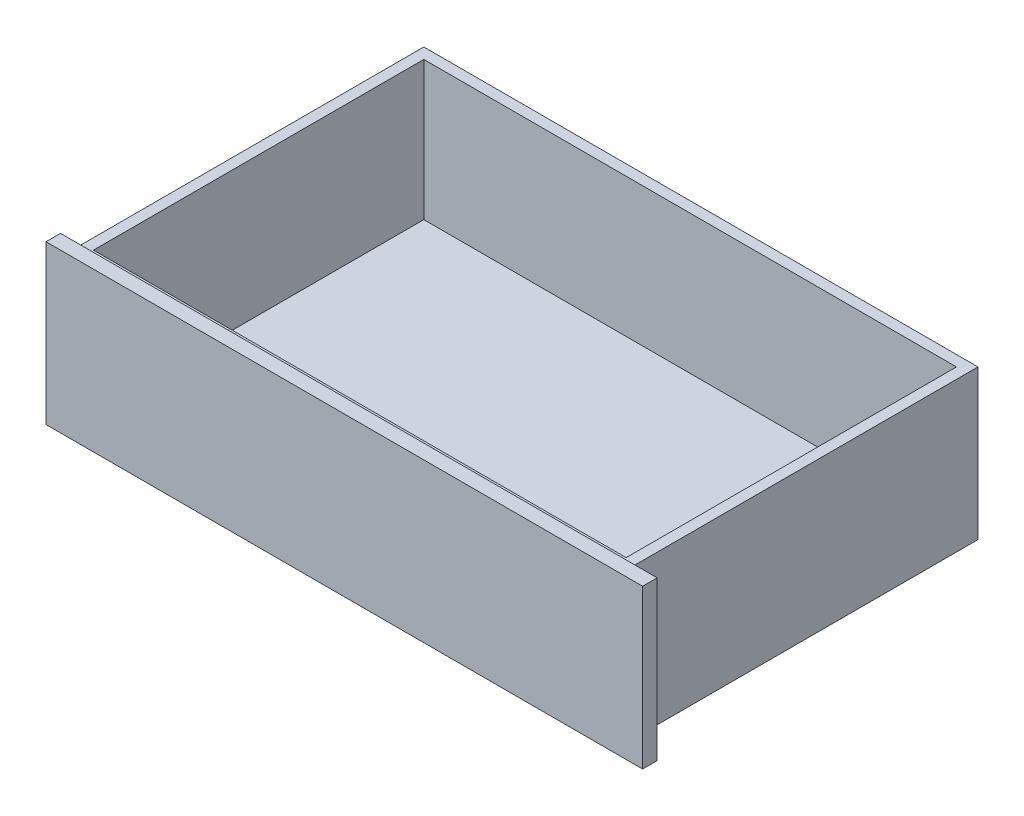
ISO-10303-21;
HEADER;
FILE_DESCRIPTION(('STEP AP214'),'2;1');
FILE_NAME('part.step','',(''),(''),'','','');
FILE_SCHEMA(('AUTOMOTIVE_DESIGN { 1 0 10303 214 1 1 1 1 }'));
ENDSEC;
DATA;
#1=APPLICATION_CONTEXT('core data for automotive mechanical design processes');
#2=APPLICATION_PROTOCOL_DEFINITION('international standard','automotive_design',2000,#1);
#3=PRODUCT_CONTEXT('',#1,'mechanical');
#4=PRODUCT('Part','Part','',(#3));
#5=PRODUCT_RELATED_PRODUCT_CATEGORY('part','',(#4));
#6=PRODUCT_DEFINITION_FORMATION('','',#4);
#7=PRODUCT_DEFINITION_CONTEXT('part definition',#1,'design');
#8=PRODUCT_DEFINITION('design','',#6,#7);
#9=PRODUCT_DEFINITION_SHAPE('','',#8);
#10=(LENGTH_UNIT() NAMED_UNIT(*) SI_UNIT(.MILLI.,.METRE.));
#11=(NAMED_UNIT(*) PLANE_ANGLE_UNIT() SI_UNIT($,.RADIAN.));
#12=(NAMED_UNIT(*) SI_UNIT($,.STERADIAN.) SOLID_ANGLE_UNIT());
#13=UNCERTAINTY_MEASURE_WITH_UNIT(LENGTH_MEASURE(1.E-05),#10,'distance_accuracy_value','');
#14=(GEOMETRIC_REPRESENTATION_CONTEXT(3) GLOBAL_UNCERTAINTY_ASSIGNED_CONTEXT((#13)) GLOBAL_UNIT_ASSIGNED_CONTEXT((#10,
#11,#12)) REPRESENTATION_CONTEXT('',''));
#15=CARTESIAN_POINT('',(0.,0.,0.));
#16=DIRECTION('',(0.,0.,1.));
#17=DIRECTION('',(1.,0.,0.));
#18=AXIS2_PLACEMENT_3D('',#15,#16,#17);
#19=CARTESIAN_POINT('',(0.,170.,0.));
#20=DIRECTION('',(0.,-1.,0.));
#21=DIRECTION('',(0.,0.,-1.));
#22=AXIS2_PLACEMENT_3D('',#19,#20,#21);
#23=PLANE('',#22);
#24=DIRECTION('',(0.,0.,-1.));
#25=VECTOR('',#24,1.);
#26=CARTESIAN_POINT('',(315.,170.,200.));
#27=LINE('',#26,#25);
#28=CARTESIAN_POINT('',(315.,170.,200.));
#29=VERTEX_POINT('',#28);
#30=CARTESIAN_POINT('',(315.,170.,-200.));
#31=VERTEX_POINT('',#30);
#32=EDGE_CURVE('E191',#29,#31,#27,.T.);
#33=ORIENTED_EDGE('',*,*,#32,.T.);
#34=DIRECTION('',(-1.,0.,0.));
#35=VECTOR('',#34,1.);
#36=CARTESIAN_POINT('',(-315.,170.,-200.));
#37=LINE('',#36,#35);
#38=CARTESIAN_POINT('',(-315.,170.,-200.));
#39=VERTEX_POINT('',#38);
#40=EDGE_CURVE('E82',#31,#39,#37,.T.);
#41=ORIENTED_EDGE('',*,*,#40,.T.);
#42=DIRECTION('',(0.,0.,1.));
#43=VECTOR('',#42,1.);
#44=CARTESIAN_POINT('',(-315.,170.,200.));
#45=LINE('',#44,#43);
#46=CARTESIAN_POINT('',(-315.,170.,200.));
#47=VERTEX_POINT('',#46);
#48=EDGE_CURVE('E195',#39,#47,#45,.T.);
#49=ORIENTED_EDGE('',*,*,#48,.T.);
#50=DIRECTION('',(1.,0.,0.));
#51=VECTOR('',#50,1.);
#52=CARTESIAN_POINT('',(-315.,170.,200.));
#53=LINE('',#52,#51);
#54=EDGE_CURVE('E57',#47,#29,#53,.T.);
#55=ORIENTED_EDGE('',*,*,#54,.T.);
#56=EDGE_LOOP('',(#33,#41,#49,#55));
#57=FACE_BOUND('',#56,.T.);
#58=DIRECTION('',(0.,0.,-1.));
#59=VECTOR('',#58,1.);
#60=CARTESIAN_POINT('',(302.7572,170.,0.));
#61=LINE('',#60,#59);
#62=CARTESIAN_POINT('',(302.7572,170.,187.7572));
#63=VERTEX_POINT('',#62);
#64=CARTESIAN_POINT('',(302.7572,170.,-187.7572));
#65=VERTEX_POINT('',#64);
#66=EDGE_CURVE('E184',#63,#65,#61,.T.);
#67=ORIENTED_EDGE('',*,*,#66,.F.);
#68=DIRECTION('',(1.,0.,0.));
#69=VECTOR('',#68,1.);
#70=CARTESIAN_POINT('',(0.,170.,187.7572));
#71=LINE('',#70,#69);
#72=CARTESIAN_POINT('',(-302.7572,170.,187.7572));
#73=VERTEX_POINT('',#72);
#74=EDGE_CURVE('E175',#73,#63,#71,.T.);
#75=ORIENTED_EDGE('',*,*,#74,.F.);
#76=DIRECTION('',(0.,0.,1.));
#77=VECTOR('',#76,1.);
#78=CARTESIAN_POINT('',(-302.7572,170.,0.));
#79=LINE('',#78,#77);
#80=CARTESIAN_POINT('',(-302.7572,170.,-187.7572));
#81=VERTEX_POINT('',#80);
#82=EDGE_CURVE('E188',#81,#73,#79,.T.);
#83=ORIENTED_EDGE('',*,*,#82,.F.);
#84=DIRECTION('',(-1.,0.,0.));
#85=VECTOR('',#84,1.);
#86=CARTESIAN_POINT('',(0.,170.,-187.7572));
#87=LINE('',#86,#85);
#88=EDGE_CURVE('E186',#65,#81,#87,.T.);
#89=ORIENTED_EDGE('',*,*,#88,.F.);
#90=EDGE_LOOP('',(#67,#75,#83,#89));
#91=FACE_BOUND('',#90,.T.);
#92=ADVANCED_FACE('F33',(#57,#91),#23,.F.);
#93=CARTESIAN_POINT('',(315.,170.,200.));
#94=DIRECTION('',(-1.,0.,0.));
#95=DIRECTION('',(0.,0.,1.));
#96=AXIS2_PLACEMENT_3D('',#93,#94,#95);
#97=PLANE('',#96);
#98=DIRECTION('',(0.,0.,-1.));
#99=VECTOR('',#98,1.);
#100=CARTESIAN_POINT('',(315.,0.,200.));
#101=LINE('',#100,#99);
#102=CARTESIAN_POINT('',(315.,0.,200.));
#103=VERTEX_POINT('',#102);
#104=CARTESIAN_POINT('',(315.,0.,-200.));
#105=VERTEX_POINT('',#104);
#106=EDGE_CURVE('E170',#103,#105,#101,.T.);
#107=ORIENTED_EDGE('',*,*,#106,.T.);
#108=DIRECTION('',(0.,-1.,0.));
#109=VECTOR('',#108,1.);
#110=CARTESIAN_POINT('',(315.,170.,-200.));
#111=LINE('',#110,#109);
#112=EDGE_CURVE('E11',#31,#105,#111,.T.);
#113=ORIENTED_EDGE('',*,*,#112,.F.);
#114=ORIENTED_EDGE('',*,*,#32,.F.);
#115=DIRECTION('',(0.,-1.,0.));
#116=VECTOR('',#115,1.);
#117=CARTESIAN_POINT('',(315.,170.,200.));
#118=LINE('',#117,#116);
#119=EDGE_CURVE('E75',#29,#103,#118,.T.);
#120=ORIENTED_EDGE('',*,*,#119,.T.);
#121=EDGE_LOOP('',(#107,#113,#114,#120));
#122=FACE_BOUND('',#121,.T.);
#123=ADVANCED_FACE('F35',(#122),#97,.F.);
#124=CARTESIAN_POINT('',(-315.,170.,-200.));
#125=DIRECTION('',(0.,0.,1.));
#126=DIRECTION('',(1.,0.,0.));
#127=AXIS2_PLACEMENT_3D('',#124,#125,#126);
#128=PLANE('',#127);
#129=DIRECTION('',(-1.,0.,0.));
#130=VECTOR('',#129,1.);
#131=CARTESIAN_POINT('',(-315.,0.,-200.));
#132=LINE('',#131,#130);
#133=CARTESIAN_POINT('',(-315.,0.,-200.));
#134=VERTEX_POINT('',#133);
#135=EDGE_CURVE('E199',#105,#134,#132,.T.);
#136=ORIENTED_EDGE('',*,*,#135,.T.);
#137=DIRECTION('',(0.,-1.,0.));
#138=VECTOR('',#137,1.);
#139=CARTESIAN_POINT('',(-315.,170.,-200.));
#140=LINE('',#139,#138);
#141=EDGE_CURVE('E41',#39,#134,#140,.T.);
#142=ORIENTED_EDGE('',*,*,#141,.F.);
#143=ORIENTED_EDGE('',*,*,#40,.F.);
#144=ORIENTED_EDGE('',*,*,#112,.T.);
#145=EDGE_LOOP('',(#136,#142,#143,#144));
#146=FACE_BOUND('',#145,.T.);
#147=ADVANCED_FACE('F247',(#146),#128,.F.);
#148=CARTESIAN_POINT('',(-315.,170.,200.));
#149=DIRECTION('',(1.,0.,0.));
#150=DIRECTION('',(0.,0.,-1.));
#151=AXIS2_PLACEMENT_3D('',#148,#149,#150);
#152=PLANE('',#151);
#153=DIRECTION('',(0.,0.,1.));
#154=VECTOR('',#153,1.);
#155=CARTESIAN_POINT('',(-315.,0.,200.));
#156=LINE('',#155,#154);
#157=CARTESIAN_POINT('',(-315.,0.,200.));
#158=VERTEX_POINT('',#157);
#159=EDGE_CURVE('E193',#134,#158,#156,.T.);
#160=ORIENTED_EDGE('',*,*,#159,.T.);
#161=DIRECTION('',(0.,-1.,0.));
#162=VECTOR('',#161,1.);
#163=CARTESIAN_POINT('',(-315.,170.,200.));
#164=LINE('',#163,#162);
#165=EDGE_CURVE('E203',#47,#158,#164,.T.);
#166=ORIENTED_EDGE('',*,*,#165,.F.);
#167=ORIENTED_EDGE('',*,*,#48,.F.);
#168=ORIENTED_EDGE('',*,*,#141,.T.);
#169=EDGE_LOOP('',(#160,#166,#167,#168));
#170=FACE_BOUND('',#169,.T.);
#171=ADVANCED_FACE('F209',(#170),#152,.F.);
#172=CARTESIAN_POINT('',(0.,0.,0.));
#173=DIRECTION('',(0.,-1.,0.));
#174=DIRECTION('',(0.,0.,-1.));
#175=AXIS2_PLACEMENT_3D('',#172,#173,#174);
#176=PLANE('',#175);
#177=ORIENTED_EDGE('',*,*,#106,.F.);
#178=DIRECTION('',(1.,0.,0.));
#179=VECTOR('',#178,1.);
#180=CARTESIAN_POINT('',(-328.,0.,200.));
#181=LINE('',#180,#179);
#182=CARTESIAN_POINT('',(350.2428,0.,200.));
#183=VERTEX_POINT('',#182);
#184=EDGE_CURVE('E214',#103,#183,#181,.T.);
#185=ORIENTED_EDGE('',*,*,#184,.T.);
#186=DIRECTION('',(0.,0.,-1.));
#187=VECTOR('',#186,1.);
#188=CARTESIAN_POINT('',(350.2428,0.,216.5));
#189=LINE('',#188,#187);
#190=CARTESIAN_POINT('',(350.2428,0.,216.5));
#191=VERTEX_POINT('',#190);
#192=EDGE_CURVE('E140',#191,#183,#189,.T.);
#193=ORIENTED_EDGE('',*,*,#192,.F.);
#194=DIRECTION('',(1.,0.,0.));
#195=VECTOR('',#194,1.);
#196=CARTESIAN_POINT('',(-328.,0.,216.5));
#197=LINE('',#196,#195);
#198=CARTESIAN_POINT('',(-328.,0.,216.5));
#199=VERTEX_POINT('',#198);
#200=EDGE_CURVE('E132',#199,#191,#197,.T.);
#201=ORIENTED_EDGE('',*,*,#200,.F.);
#202=DIRECTION('',(0.,0.,-1.));
#203=VECTOR('',#202,1.);
#204=CARTESIAN_POINT('',(-328.,0.,216.5));
#205=LINE('',#204,#203);
#206=CARTESIAN_POINT('',(-328.,0.,200.));
#207=VERTEX_POINT('',#206);
#208=EDGE_CURVE('E137',#199,#207,#205,.T.);
#209=ORIENTED_EDGE('',*,*,#208,.T.);
#210=EDGE_CURVE('E211',#207,#158,#181,.T.);
#211=ORIENTED_EDGE('',*,*,#210,.T.);
#212=ORIENTED_EDGE('',*,*,#159,.F.);
#213=ORIENTED_EDGE('',*,*,#135,.F.);
#214=EDGE_LOOP('',(#177,#185,#193,#201,#209,#211,#212,#213));
#215=FACE_BOUND('',#214,.T.);
#216=ADVANCED_FACE('F134',(#215),#176,.T.);
#217=CARTESIAN_POINT('',(302.7572,170.,200.));
#218=DIRECTION('',(-1.,0.,0.));
#219=DIRECTION('',(0.,0.,1.));
#220=AXIS2_PLACEMENT_3D('',#217,#218,#219);
#221=PLANE('',#220);
#222=DIRECTION('',(0.,0.,-1.));
#223=VECTOR('',#222,1.);
#224=CARTESIAN_POINT('',(302.7572,12.2428,0.));
#225=LINE('',#224,#223);
#226=CARTESIAN_POINT('',(302.7572,12.2428,187.7572));
#227=VERTEX_POINT('',#226);
#228=CARTESIAN_POINT('',(302.7572,12.2428,-187.7572));
#229=VERTEX_POINT('',#228);
#230=EDGE_CURVE('E158',#227,#229,#225,.T.);
#231=ORIENTED_EDGE('',*,*,#230,.F.);
#232=DIRECTION('',(0.,-1.,0.));
#233=VECTOR('',#232,1.);
#234=CARTESIAN_POINT('',(302.7572,170.,187.7572));
#235=LINE('',#234,#233);
#236=EDGE_CURVE('E172',#63,#227,#235,.T.);
#237=ORIENTED_EDGE('',*,*,#236,.F.);
#238=ORIENTED_EDGE('',*,*,#66,.T.);
#239=DIRECTION('',(0.,-1.,0.));
#240=VECTOR('',#239,1.);
#241=CARTESIAN_POINT('',(302.7572,170.,-187.7572));
#242=LINE('',#241,#240);
#243=EDGE_CURVE('E167',#65,#229,#242,.T.);
#244=ORIENTED_EDGE('',*,*,#243,.T.);
#245=EDGE_LOOP('',(#231,#237,#238,#244));
#246=FACE_BOUND('',#245,.T.);
#247=ADVANCED_FACE('F254',(#246),#221,.T.);
#248=CARTESIAN_POINT('',(-315.,170.,-187.7572));
#249=DIRECTION('',(0.,0.,1.));
#250=DIRECTION('',(1.,0.,0.));
#251=AXIS2_PLACEMENT_3D('',#248,#249,#250);
#252=PLANE('',#251);
#253=DIRECTION('',(-1.,0.,0.));
#254=VECTOR('',#253,1.);
#255=CARTESIAN_POINT('',(0.,12.2428,-187.7572));
#256=LINE('',#255,#254);
#257=CARTESIAN_POINT('',(-302.7572,12.2428,-187.7572));
#258=VERTEX_POINT('',#257);
#259=EDGE_CURVE('E161',#229,#258,#256,.T.);
#260=ORIENTED_EDGE('',*,*,#259,.F.);
#261=ORIENTED_EDGE('',*,*,#243,.F.);
#262=ORIENTED_EDGE('',*,*,#88,.T.);
#263=DIRECTION('',(0.,-1.,0.));
#264=VECTOR('',#263,1.);
#265=CARTESIAN_POINT('',(-302.7572,170.,-187.7572));
#266=LINE('',#265,#264);
#267=EDGE_CURVE('E171',#81,#258,#266,.T.);
#268=ORIENTED_EDGE('',*,*,#267,.T.);
#269=EDGE_LOOP('',(#260,#261,#262,#268));
#270=FACE_BOUND('',#269,.T.);
#271=ADVANCED_FACE('F277',(#270),#252,.T.);
#272=CARTESIAN_POINT('',(-302.7572,170.,200.));
#273=DIRECTION('',(1.,0.,0.));
#274=DIRECTION('',(0.,0.,-1.));
#275=AXIS2_PLACEMENT_3D('',#272,#273,#274);
#276=PLANE('',#275);
#277=DIRECTION('',(0.,0.,1.));
#278=VECTOR('',#277,1.);
#279=CARTESIAN_POINT('',(-302.7572,12.2428,0.));
#280=LINE('',#279,#278);
#281=CARTESIAN_POINT('',(-302.7572,12.2428,187.7572));
#282=VERTEX_POINT('',#281);
#283=EDGE_CURVE('E177',#258,#282,#280,.T.);
#284=ORIENTED_EDGE('',*,*,#283,.F.);
#285=ORIENTED_EDGE('',*,*,#267,.F.);
#286=ORIENTED_EDGE('',*,*,#82,.T.);
#287=DIRECTION('',(0.,-1.,0.));
#288=VECTOR('',#287,1.);
#289=CARTESIAN_POINT('',(-302.7572,170.,187.7572));
#290=LINE('',#289,#288);
#291=EDGE_CURVE('E48',#73,#282,#290,.T.);
#292=ORIENTED_EDGE('',*,*,#291,.T.);
#293=EDGE_LOOP('',(#284,#285,#286,#292));
#294=FACE_BOUND('',#293,.T.);
#295=ADVANCED_FACE('F285',(#294),#276,.T.);
#296=CARTESIAN_POINT('',(-315.,170.,187.7572));
#297=DIRECTION('',(0.,0.,-1.));
#298=DIRECTION('',(-1.,0.,0.));
#299=AXIS2_PLACEMENT_3D('',#296,#297,#298);
#300=PLANE('',#299);
#301=DIRECTION('',(1.,0.,0.));
#302=VECTOR('',#301,1.);
#303=CARTESIAN_POINT('',(0.,12.2428,187.7572));
#304=LINE('',#303,#302);
#305=EDGE_CURVE('E181',#282,#227,#304,.T.);
#306=ORIENTED_EDGE('',*,*,#305,.F.);
#307=ORIENTED_EDGE('',*,*,#291,.F.);
#308=ORIENTED_EDGE('',*,*,#74,.T.);
#309=ORIENTED_EDGE('',*,*,#236,.T.);
#310=EDGE_LOOP('',(#306,#307,#308,#309));
#311=FACE_BOUND('',#310,.T.);
#312=ADVANCED_FACE('F293',(#311),#300,.T.);
#313=CARTESIAN_POINT('',(0.,12.2428,0.));
#314=DIRECTION('',(0.,-1.,0.));
#315=DIRECTION('',(0.,0.,-1.));
#316=AXIS2_PLACEMENT_3D('',#313,#314,#315);
#317=PLANE('',#316);
#318=ORIENTED_EDGE('',*,*,#230,.T.);
#319=ORIENTED_EDGE('',*,*,#259,.T.);
#320=ORIENTED_EDGE('',*,*,#283,.T.);
#321=ORIENTED_EDGE('',*,*,#305,.T.);
#322=EDGE_LOOP('',(#318,#319,#320,#321));
#323=FACE_BOUND('',#322,.T.);
#324=ADVANCED_FACE('F240',(#323),#317,.F.);
#325=CARTESIAN_POINT('',(-328.,180.,216.5));
#326=DIRECTION('',(1.,0.,0.));
#327=DIRECTION('',(0.,1.,0.));
#328=AXIS2_PLACEMENT_3D('',#325,#326,#327);
#329=PLANE('',#328);
#330=DIRECTION('',(0.,-1.,0.));
#331=VECTOR('',#330,1.);
#332=CARTESIAN_POINT('',(-328.,180.,200.));
#333=LINE('',#332,#331);
#334=CARTESIAN_POINT('',(-328.,180.,200.));
#335=VERTEX_POINT('',#334);
#336=EDGE_CURVE('E157',#335,#207,#333,.T.);
#337=ORIENTED_EDGE('',*,*,#336,.T.);
#338=ORIENTED_EDGE('',*,*,#208,.F.);
#339=DIRECTION('',(0.,-1.,0.));
#340=VECTOR('',#339,1.);
#341=CARTESIAN_POINT('',(-328.,180.,216.5));
#342=LINE('',#341,#340);
#343=CARTESIAN_POINT('',(-328.,180.,216.5));
#344=VERTEX_POINT('',#343);
#345=EDGE_CURVE('E144',#344,#199,#342,.T.);
#346=ORIENTED_EDGE('',*,*,#345,.F.);
#347=DIRECTION('',(0.,0.,-1.));
#348=VECTOR('',#347,1.);
#349=CARTESIAN_POINT('',(-328.,180.,216.5));
#350=LINE('',#349,#348);
#351=EDGE_CURVE('E221',#344,#335,#350,.T.);
#352=ORIENTED_EDGE('',*,*,#351,.T.);
#353=EDGE_LOOP('',(#337,#338,#346,#352));
#354=FACE_BOUND('',#353,.T.);
#355=ADVANCED_FACE('F155',(#354),#329,.F.);
#356=CARTESIAN_POINT('',(350.2428,180.,216.5));
#357=DIRECTION('',(-1.,0.,0.));
#358=DIRECTION('',(0.,-1.,0.));
#359=AXIS2_PLACEMENT_3D('',#356,#357,#358);
#360=PLANE('',#359);
#361=DIRECTION('',(0.,1.,0.));
#362=VECTOR('',#361,1.);
#363=CARTESIAN_POINT('',(350.2428,180.,200.));
#364=LINE('',#363,#362);
#365=CARTESIAN_POINT('',(350.2428,180.,200.));
#366=VERTEX_POINT('',#365);
#367=EDGE_CURVE('E213',#183,#366,#364,.T.);
#368=ORIENTED_EDGE('',*,*,#367,.T.);
#369=DIRECTION('',(0.,0.,-1.));
#370=VECTOR('',#369,1.);
#371=CARTESIAN_POINT('',(350.2428,180.,216.5));
#372=LINE('',#371,#370);
#373=CARTESIAN_POINT('',(350.2428,180.,216.5));
#374=VERTEX_POINT('',#373);
#375=EDGE_CURVE('E163',#374,#366,#372,.T.);
#376=ORIENTED_EDGE('',*,*,#375,.F.);
#377=DIRECTION('',(0.,1.,0.));
#378=VECTOR('',#377,1.);
#379=CARTESIAN_POINT('',(350.2428,180.,216.5));
#380=LINE('',#379,#378);
#381=EDGE_CURVE('E143',#191,#374,#380,.T.);
#382=ORIENTED_EDGE('',*,*,#381,.F.);
#383=ORIENTED_EDGE('',*,*,#192,.T.);
#384=EDGE_LOOP('',(#368,#376,#382,#383));
#385=FACE_BOUND('',#384,.T.);
#386=ADVANCED_FACE('F231',(#385),#360,.F.);
#387=CARTESIAN_POINT('',(-328.,180.,216.5));
#388=DIRECTION('',(0.,-1.,0.));
#389=DIRECTION('',(0.,0.,-1.));
#390=AXIS2_PLACEMENT_3D('',#387,#388,#389);
#391=PLANE('',#390);
#392=DIRECTION('',(-1.,0.,0.));
#393=VECTOR('',#392,1.);
#394=CARTESIAN_POINT('',(-328.,180.,200.));
#395=LINE('',#394,#393);
#396=EDGE_CURVE('E153',#366,#335,#395,.T.);
#397=ORIENTED_EDGE('',*,*,#396,.T.);
#398=ORIENTED_EDGE('',*,*,#351,.F.);
#399=DIRECTION('',(-1.,0.,0.));
#400=VECTOR('',#399,1.);
#401=CARTESIAN_POINT('',(-328.,180.,216.5));
#402=LINE('',#401,#400);
#403=EDGE_CURVE('E149',#374,#344,#402,.T.);
#404=ORIENTED_EDGE('',*,*,#403,.F.);
#405=ORIENTED_EDGE('',*,*,#375,.T.);
#406=EDGE_LOOP('',(#397,#398,#404,#405));
#407=FACE_BOUND('',#406,.T.);
#408=ADVANCED_FACE('F226',(#407),#391,.F.);
#409=CARTESIAN_POINT('',(0.,0.,216.5));
#410=DIRECTION('',(0.,0.,1.));
#411=DIRECTION('',(1.,0.,0.));
#412=AXIS2_PLACEMENT_3D('',#409,#410,#411);
#413=PLANE('',#412);
#414=ORIENTED_EDGE('',*,*,#345,.T.);
#415=ORIENTED_EDGE('',*,*,#200,.T.);
#416=ORIENTED_EDGE('',*,*,#381,.T.);
#417=ORIENTED_EDGE('',*,*,#403,.T.);
#418=EDGE_LOOP('',(#414,#415,#416,#417));
#419=FACE_BOUND('',#418,.T.);
#420=ADVANCED_FACE('F147',(#419),#413,.T.);
#421=CARTESIAN_POINT('',(0.,0.,200.));
#422=DIRECTION('',(0.,0.,1.));
#423=DIRECTION('',(1.,0.,0.));
#424=AXIS2_PLACEMENT_3D('',#421,#422,#423);
#425=PLANE('',#424);
#426=ORIENTED_EDGE('',*,*,#119,.F.);
#427=ORIENTED_EDGE('',*,*,#54,.F.);
#428=ORIENTED_EDGE('',*,*,#165,.T.);
#429=ORIENTED_EDGE('',*,*,#210,.F.);
#430=ORIENTED_EDGE('',*,*,#336,.F.);
#431=ORIENTED_EDGE('',*,*,#396,.F.);
#432=ORIENTED_EDGE('',*,*,#367,.F.);
#433=ORIENTED_EDGE('',*,*,#184,.F.);
#434=EDGE_LOOP('',(#426,#427,#428,#429,#430,#431,#432,#433));
#435=FACE_BOUND('',#434,.T.);
#436=ADVANCED_FACE('F229',(#435),#425,.F.);
#437=CLOSED_SHELL('',(#92,#123,#147,#171,#216,#247,#271,#295,#312,#324,#355,#386,#408,#420,#436));
#438=MANIFOLD_SOLID_BREP('B2',#437);
#439=ADVANCED_BREP_SHAPE_REPRESENTATION('',(#18,#438),#14);
#440=SHAPE_DEFINITION_REPRESENTATION(#9,#439);
ENDSEC;
END-ISO-10303-21;
